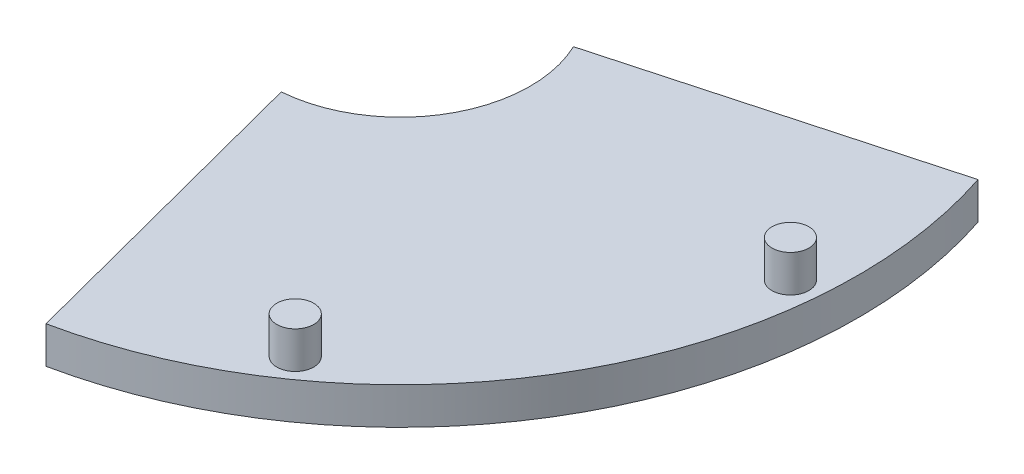
ISO-10303-21;
HEADER;
FILE_DESCRIPTION(('STEP AP214'),'2;1');
FILE_NAME('part.step','',(''),(''),'','','');
FILE_SCHEMA(('AUTOMOTIVE_DESIGN { 1 0 10303 214 1 1 1 1 }'));
ENDSEC;
DATA;
#1=APPLICATION_CONTEXT('core data for automotive mechanical design processes');
#2=APPLICATION_PROTOCOL_DEFINITION('international standard','automotive_design',2000,#1);
#3=PRODUCT_CONTEXT('',#1,'mechanical');
#4=PRODUCT('Part','Part','',(#3));
#5=PRODUCT_RELATED_PRODUCT_CATEGORY('part','',(#4));
#6=PRODUCT_DEFINITION_FORMATION('','',#4);
#7=PRODUCT_DEFINITION_CONTEXT('part definition',#1,'design');
#8=PRODUCT_DEFINITION('design','',#6,#7);
#9=PRODUCT_DEFINITION_SHAPE('','',#8);
#10=(LENGTH_UNIT() NAMED_UNIT(*) SI_UNIT(.MILLI.,.METRE.));
#11=(NAMED_UNIT(*) PLANE_ANGLE_UNIT() SI_UNIT($,.RADIAN.));
#12=(NAMED_UNIT(*) SI_UNIT($,.STERADIAN.) SOLID_ANGLE_UNIT());
#13=UNCERTAINTY_MEASURE_WITH_UNIT(LENGTH_MEASURE(1.E-05),#10,'distance_accuracy_value','');
#14=(GEOMETRIC_REPRESENTATION_CONTEXT(3) GLOBAL_UNCERTAINTY_ASSIGNED_CONTEXT((#13)) GLOBAL_UNIT_ASSIGNED_CONTEXT((#10,
#11,#12)) REPRESENTATION_CONTEXT('',''));
#15=CARTESIAN_POINT('',(0.,0.,0.));
#16=DIRECTION('',(0.,0.,1.));
#17=DIRECTION('',(1.,0.,0.));
#18=AXIS2_PLACEMENT_3D('',#15,#16,#17);
#19=CARTESIAN_POINT('',(-106.14963845054,3.,-33.7645527606304));
#20=DIRECTION('',(0.,-1.,0.));
#21=DIRECTION('',(0.,0.,-1.));
#22=AXIS2_PLACEMENT_3D('',#19,#20,#21);
#23=PLANE('',#22);
#24=CARTESIAN_POINT('',(-106.14963845054,3.,-33.7645527606304));
#25=DIRECTION('',(0.,-1.,0.));
#26=DIRECTION('',(0.,0.,-1.));
#27=AXIS2_PLACEMENT_3D('',#24,#25,#26);
#28=CIRCLE('',#27,10.5540333320216);
#29=CARTESIAN_POINT('',(-96.6214303827781,3.,-38.3033709538239));
#30=VERTEX_POINT('',#29);
#31=CARTESIAN_POINT('',(-105.316266275123,3.,-23.2434734248083));
#32=VERTEX_POINT('',#31);
#33=EDGE_CURVE('E91',#30,#32,#28,.T.);
#34=ORIENTED_EDGE('',*,*,#33,.T.);
#35=DIRECTION('',(0.252739595459672,0.,0.967534338867041));
#36=VECTOR('',#35,1.);
#37=CARTESIAN_POINT('',(-105.316266275123,3.,-23.2434734248083));
#38=LINE('',#37,#36);
#39=CARTESIAN_POINT('',(-98.5532348641322,3.,2.64667296507402));
#40=VERTEX_POINT('',#39);
#41=EDGE_CURVE('E86',#32,#40,#38,.T.);
#42=ORIENTED_EDGE('',*,*,#41,.T.);
#43=CARTESIAN_POINT('',(-106.14963845054,3.,-33.7645527606305));
#44=DIRECTION('',(0.,1.,0.));
#45=DIRECTION('',(0.,0.,-1.));
#46=AXIS2_PLACEMENT_3D('',#43,#44,#45);
#47=CIRCLE('',#46,37.1951973552473);
#48=CARTESIAN_POINT('',(-70.8183901959464,3.,-45.3914871402544));
#49=VERTEX_POINT('',#48);
#50=EDGE_CURVE('E89',#40,#49,#47,.T.);
#51=ORIENTED_EDGE('',*,*,#50,.T.);
#52=DIRECTION('',(-0.964279114222475,0.,0.264888259223242));
#53=VECTOR('',#52,1.);
#54=CARTESIAN_POINT('',(-96.6214303827781,3.,-38.3033709538239));
#55=LINE('',#54,#53);
#56=EDGE_CURVE('E56',#49,#30,#55,.T.);
#57=ORIENTED_EDGE('',*,*,#56,.T.);
#58=EDGE_LOOP('',(#34,#42,#51,#57));
#59=FACE_BOUND('',#58,.T.);
#60=CARTESIAN_POINT('',(-86.1186406553284,3.,-5.18383828071525));
#61=DIRECTION('',(0.,1.,0.));
#62=DIRECTION('',(0.,0.,1.));
#63=AXIS2_PLACEMENT_3D('',#60,#61,#62);
#64=CIRCLE('',#63,1.50000000000001);
#65=CARTESIAN_POINT('',(-86.1186406553284,3.,-3.68383828071523));
#66=VERTEX_POINT('',#65);
#67=EDGE_CURVE('E106',#66,#66,#64,.T.);
#68=ORIENTED_EDGE('',*,*,#67,.F.);
#69=EDGE_LOOP('',(#68));
#70=FACE_BOUND('',#69,.T.);
#71=CARTESIAN_POINT('',(-71.3731141620043,3.,-30.6957788100005));
#72=DIRECTION('',(0.,1.,0.));
#73=DIRECTION('',(0.,0.,1.));
#74=AXIS2_PLACEMENT_3D('',#71,#72,#73);
#75=CIRCLE('',#74,1.50000000000001);
#76=CARTESIAN_POINT('',(-71.3731141620043,3.,-29.1957788100005));
#77=VERTEX_POINT('',#76);
#78=EDGE_CURVE('E119',#77,#77,#75,.T.);
#79=ORIENTED_EDGE('',*,*,#78,.F.);
#80=EDGE_LOOP('',(#79));
#81=FACE_BOUND('',#80,.T.);
#82=ADVANCED_FACE('F39',(#59,#70,#81),#23,.F.);
#83=CARTESIAN_POINT('',(-106.14963845054,0.,-33.7645527606304));
#84=DIRECTION('',(0.,-1.,0.));
#85=DIRECTION('',(0.,0.,-1.));
#86=AXIS2_PLACEMENT_3D('',#83,#84,#85);
#87=PLANE('',#86);
#88=CARTESIAN_POINT('',(-106.14963845054,0.,-33.7645527606304));
#89=DIRECTION('',(0.,-1.,0.));
#90=DIRECTION('',(0.,0.,-1.));
#91=AXIS2_PLACEMENT_3D('',#88,#89,#90);
#92=CIRCLE('',#91,10.5540333320216);
#93=CARTESIAN_POINT('',(-96.6214303827781,0.,-38.3033709538239));
#94=VERTEX_POINT('',#93);
#95=CARTESIAN_POINT('',(-105.316266275123,0.,-23.2434734248083));
#96=VERTEX_POINT('',#95);
#97=EDGE_CURVE('E103',#94,#96,#92,.T.);
#98=ORIENTED_EDGE('',*,*,#97,.F.);
#99=DIRECTION('',(-0.964279114222475,0.,0.264888259223242));
#100=VECTOR('',#99,1.);
#101=CARTESIAN_POINT('',(-96.6214303827781,0.,-38.3033709538239));
#102=LINE('',#101,#100);
#103=CARTESIAN_POINT('',(-70.8183901959464,0.,-45.3914871402544));
#104=VERTEX_POINT('',#103);
#105=EDGE_CURVE('E79',#104,#94,#102,.T.);
#106=ORIENTED_EDGE('',*,*,#105,.F.);
#107=CARTESIAN_POINT('',(-106.14963845054,0.,-33.7645527606305));
#108=DIRECTION('',(0.,1.,0.));
#109=DIRECTION('',(0.,0.,-1.));
#110=AXIS2_PLACEMENT_3D('',#107,#108,#109);
#111=CIRCLE('',#110,37.1951973552473);
#112=CARTESIAN_POINT('',(-98.5532348641322,0.,2.64667296507402));
#113=VERTEX_POINT('',#112);
#114=EDGE_CURVE('E73',#113,#104,#111,.T.);
#115=ORIENTED_EDGE('',*,*,#114,.F.);
#116=DIRECTION('',(0.252739595459672,0.,0.967534338867041));
#117=VECTOR('',#116,1.);
#118=CARTESIAN_POINT('',(-105.316266275123,0.,-23.2434734248083));
#119=LINE('',#118,#117);
#120=EDGE_CURVE('E95',#96,#113,#119,.T.);
#121=ORIENTED_EDGE('',*,*,#120,.F.);
#122=EDGE_LOOP('',(#98,#106,#115,#121));
#123=FACE_BOUND('',#122,.T.);
#124=ADVANCED_FACE('F114',(#123),#87,.T.);
#125=CARTESIAN_POINT('',(-106.14963845054,3.,-33.7645527606304));
#126=DIRECTION('',(0.,-1.,0.));
#127=DIRECTION('',(0.,0.,-1.));
#128=AXIS2_PLACEMENT_3D('',#125,#126,#127);
#129=CYLINDRICAL_SURFACE('',#128,10.5540333320216);
#130=ORIENTED_EDGE('',*,*,#97,.T.);
#131=DIRECTION('',(0.,-1.,0.));
#132=VECTOR('',#131,1.);
#133=CARTESIAN_POINT('',(-105.316266275123,3.,-23.2434734248083));
#134=LINE('',#133,#132);
#135=EDGE_CURVE('E11',#32,#96,#134,.T.);
#136=ORIENTED_EDGE('',*,*,#135,.F.);
#137=ORIENTED_EDGE('',*,*,#33,.F.);
#138=DIRECTION('',(0.,-1.,0.));
#139=VECTOR('',#138,1.);
#140=CARTESIAN_POINT('',(-96.6214303827781,3.,-38.3033709538239));
#141=LINE('',#140,#139);
#142=EDGE_CURVE('E99',#30,#94,#141,.T.);
#143=ORIENTED_EDGE('',*,*,#142,.T.);
#144=EDGE_LOOP('',(#130,#136,#137,#143));
#145=FACE_BOUND('',#144,.T.);
#146=ADVANCED_FACE('F41',(#145),#129,.F.);
#147=CARTESIAN_POINT('',(-105.316266275123,3.,-23.2434734248083));
#148=DIRECTION('',(0.967534338867041,0.,-0.252739595459672));
#149=DIRECTION('',(-0.252739595459672,0.,-0.967534338867041));
#150=AXIS2_PLACEMENT_3D('',#147,#148,#149);
#151=PLANE('',#150);
#152=ORIENTED_EDGE('',*,*,#120,.T.);
#153=DIRECTION('',(0.,-1.,0.));
#154=VECTOR('',#153,1.);
#155=CARTESIAN_POINT('',(-98.5532348641322,3.,2.64667296507402));
#156=LINE('',#155,#154);
#157=EDGE_CURVE('E48',#40,#113,#156,.T.);
#158=ORIENTED_EDGE('',*,*,#157,.F.);
#159=ORIENTED_EDGE('',*,*,#41,.F.);
#160=ORIENTED_EDGE('',*,*,#135,.T.);
#161=EDGE_LOOP('',(#152,#158,#159,#160));
#162=FACE_BOUND('',#161,.T.);
#163=ADVANCED_FACE('F94',(#162),#151,.F.);
#164=CARTESIAN_POINT('',(-106.14963845054,3.,-33.7645527606305));
#165=DIRECTION('',(0.,-1.,0.));
#166=DIRECTION('',(0.,0.,-1.));
#167=AXIS2_PLACEMENT_3D('',#164,#165,#166);
#168=CYLINDRICAL_SURFACE('',#167,37.1951973552473);
#169=ORIENTED_EDGE('',*,*,#114,.T.);
#170=DIRECTION('',(0.,-1.,0.));
#171=VECTOR('',#170,1.);
#172=CARTESIAN_POINT('',(-70.8183901959464,3.,-45.3914871402544));
#173=LINE('',#172,#171);
#174=EDGE_CURVE('E96',#49,#104,#173,.T.);
#175=ORIENTED_EDGE('',*,*,#174,.F.);
#176=ORIENTED_EDGE('',*,*,#50,.F.);
#177=ORIENTED_EDGE('',*,*,#157,.T.);
#178=EDGE_LOOP('',(#169,#175,#176,#177));
#179=FACE_BOUND('',#178,.T.);
#180=ADVANCED_FACE('F97',(#179),#168,.T.);
#181=CARTESIAN_POINT('',(-96.6214303827781,3.,-38.3033709538239));
#182=DIRECTION('',(0.264888259223242,0.,0.964279114222475));
#183=DIRECTION('',(0.964279114222475,0.,-0.264888259223242));
#184=AXIS2_PLACEMENT_3D('',#181,#182,#183);
#185=PLANE('',#184);
#186=ORIENTED_EDGE('',*,*,#105,.T.);
#187=ORIENTED_EDGE('',*,*,#142,.F.);
#188=ORIENTED_EDGE('',*,*,#56,.F.);
#189=ORIENTED_EDGE('',*,*,#174,.T.);
#190=EDGE_LOOP('',(#186,#187,#188,#189));
#191=FACE_BOUND('',#190,.T.);
#192=ADVANCED_FACE('F111',(#191),#185,.F.);
#193=CARTESIAN_POINT('',(-71.3731141620043,0.,-30.6957788100005));
#194=DIRECTION('',(0.,1.,0.));
#195=DIRECTION('',(0.,0.,1.));
#196=AXIS2_PLACEMENT_3D('',#193,#194,#195);
#197=CYLINDRICAL_SURFACE('',#196,1.50000000000001);
#198=CARTESIAN_POINT('',(-71.3731141620043,6.,-30.6957788100005));
#199=DIRECTION('',(0.,1.,0.));
#200=DIRECTION('',(0.,0.,1.));
#201=AXIS2_PLACEMENT_3D('',#198,#199,#200);
#202=CIRCLE('',#201,1.50000000000001);
#203=CARTESIAN_POINT('',(-71.3731141620043,6.,-29.1957788100005));
#204=VERTEX_POINT('',#203);
#205=EDGE_CURVE('E122',#204,#204,#202,.T.);
#206=ORIENTED_EDGE('',*,*,#205,.F.);
#207=EDGE_LOOP('',(#206));
#208=FACE_BOUND('',#207,.T.);
#209=ORIENTED_EDGE('',*,*,#78,.T.);
#210=EDGE_LOOP('',(#209));
#211=FACE_BOUND('',#210,.T.);
#212=ADVANCED_FACE('F142',(#208,#211),#197,.T.);
#213=CARTESIAN_POINT('',(-71.3731141620043,6.,-30.6957788100005));
#214=DIRECTION('',(0.,1.,0.));
#215=DIRECTION('',(0.,0.,1.));
#216=AXIS2_PLACEMENT_3D('',#213,#214,#215);
#217=PLANE('',#216);
#218=ORIENTED_EDGE('',*,*,#205,.T.);
#219=EDGE_LOOP('',(#218));
#220=FACE_BOUND('',#219,.T.);
#221=ADVANCED_FACE('F134',(#220),#217,.T.);
#222=CARTESIAN_POINT('',(-86.1186406553284,0.,-5.18383828071525));
#223=DIRECTION('',(0.,1.,0.));
#224=DIRECTION('',(0.,0.,1.));
#225=AXIS2_PLACEMENT_3D('',#222,#223,#224);
#226=CYLINDRICAL_SURFACE('',#225,1.50000000000001);
#227=CARTESIAN_POINT('',(-86.1186406553284,6.,-5.18383828071525));
#228=DIRECTION('',(0.,1.,0.));
#229=DIRECTION('',(0.,0.,1.));
#230=AXIS2_PLACEMENT_3D('',#227,#228,#229);
#231=CIRCLE('',#230,1.50000000000001);
#232=CARTESIAN_POINT('',(-86.1186406553284,6.,-3.68383828071523));
#233=VERTEX_POINT('',#232);
#234=EDGE_CURVE('E125',#233,#233,#231,.T.);
#235=ORIENTED_EDGE('',*,*,#234,.F.);
#236=EDGE_LOOP('',(#235));
#237=FACE_BOUND('',#236,.T.);
#238=ORIENTED_EDGE('',*,*,#67,.T.);
#239=EDGE_LOOP('',(#238));
#240=FACE_BOUND('',#239,.T.);
#241=ADVANCED_FACE('F131',(#237,#240),#226,.T.);
#242=CARTESIAN_POINT('',(-86.1186406553284,6.,-5.18383828071525));
#243=DIRECTION('',(0.,1.,0.));
#244=DIRECTION('',(0.,0.,1.));
#245=AXIS2_PLACEMENT_3D('',#242,#243,#244);
#246=PLANE('',#245);
#247=ORIENTED_EDGE('',*,*,#234,.T.);
#248=EDGE_LOOP('',(#247));
#249=FACE_BOUND('',#248,.T.);
#250=ADVANCED_FACE('F129',(#249),#246,.T.);
#251=CLOSED_SHELL('',(#82,#124,#146,#163,#180,#192,#212,#221,#241,#250));
#252=MANIFOLD_SOLID_BREP('B2',#251);
#253=ADVANCED_BREP_SHAPE_REPRESENTATION('',(#18,#252),#14);
#254=SHAPE_DEFINITION_REPRESENTATION(#9,#253);
ENDSEC;
END-ISO-10303-21;
